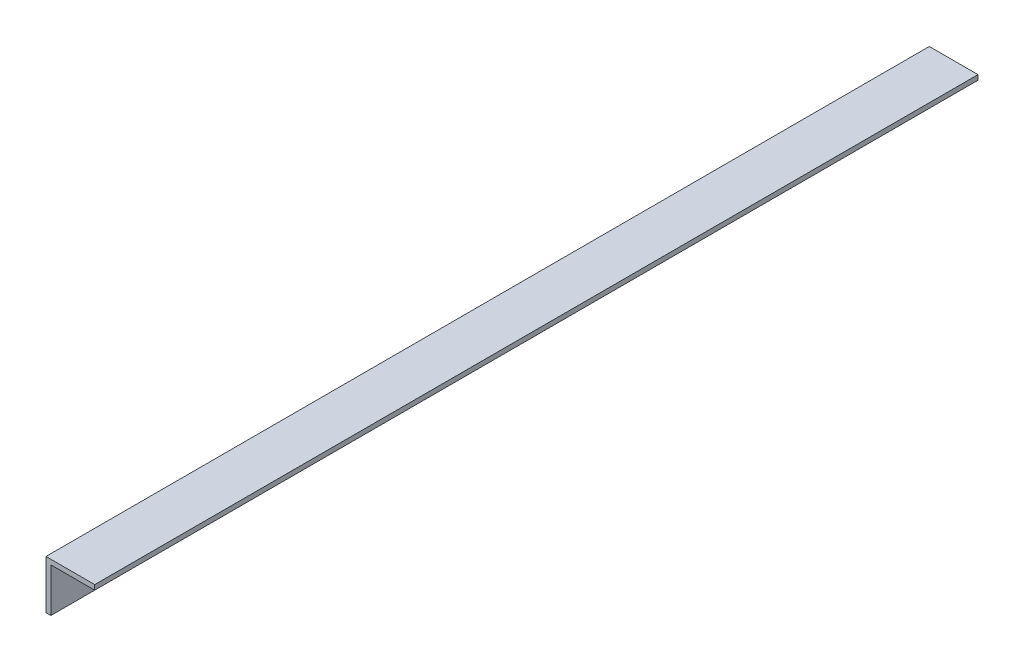
ISO-10303-21;
HEADER;
FILE_DESCRIPTION(('STEP AP214'),'2;1');
FILE_NAME('part.step','',(''),(''),'','','');
FILE_SCHEMA(('AUTOMOTIVE_DESIGN { 1 0 10303 214 1 1 1 1 }'));
ENDSEC;
DATA;
#1=APPLICATION_CONTEXT('core data for automotive mechanical design processes');
#2=APPLICATION_PROTOCOL_DEFINITION('international standard','automotive_design',2000,#1);
#3=PRODUCT_CONTEXT('',#1,'mechanical');
#4=PRODUCT('Part','Part','',(#3));
#5=PRODUCT_RELATED_PRODUCT_CATEGORY('part','',(#4));
#6=PRODUCT_DEFINITION_FORMATION('','',#4);
#7=PRODUCT_DEFINITION_CONTEXT('part definition',#1,'design');
#8=PRODUCT_DEFINITION('design','',#6,#7);
#9=PRODUCT_DEFINITION_SHAPE('','',#8);
#10=(LENGTH_UNIT() NAMED_UNIT(*) SI_UNIT(.MILLI.,.METRE.));
#11=(NAMED_UNIT(*) PLANE_ANGLE_UNIT() SI_UNIT($,.RADIAN.));
#12=(NAMED_UNIT(*) SI_UNIT($,.STERADIAN.) SOLID_ANGLE_UNIT());
#13=UNCERTAINTY_MEASURE_WITH_UNIT(LENGTH_MEASURE(1.E-05),#10,'distance_accuracy_value','');
#14=(GEOMETRIC_REPRESENTATION_CONTEXT(3) GLOBAL_UNCERTAINTY_ASSIGNED_CONTEXT((#13)) GLOBAL_UNIT_ASSIGNED_CONTEXT((#10,
#11,#12)) REPRESENTATION_CONTEXT('',''));
#15=CARTESIAN_POINT('',(0.,0.,0.));
#16=DIRECTION('',(0.,0.,1.));
#17=DIRECTION('',(1.,0.,0.));
#18=AXIS2_PLACEMENT_3D('',#15,#16,#17);
#19=CARTESIAN_POINT('',(-25.4,-2.54,460.375));
#20=DIRECTION('',(0.,1.,0.));
#21=DIRECTION('',(0.,0.,1.));
#22=AXIS2_PLACEMENT_3D('',#19,#20,#21);
#23=PLANE('',#22);
#24=DIRECTION('',(1.,0.,0.));
#25=VECTOR('',#24,1.);
#26=CARTESIAN_POINT('',(-25.4,-2.54,0.));
#27=LINE('',#26,#25);
#28=CARTESIAN_POINT('',(-22.86,-2.54,0.));
#29=VERTEX_POINT('',#28);
#30=CARTESIAN_POINT('',(0.,-2.54,0.));
#31=VERTEX_POINT('',#30);
#32=EDGE_CURVE('E113',#29,#31,#27,.T.);
#33=ORIENTED_EDGE('',*,*,#32,.T.);
#34=DIRECTION('',(0.,0.,-1.));
#35=VECTOR('',#34,1.);
#36=CARTESIAN_POINT('',(0.,-2.54,460.375));
#37=LINE('',#36,#35);
#38=CARTESIAN_POINT('',(0.,-2.54,460.375));
#39=VERTEX_POINT('',#38);
#40=EDGE_CURVE('E11',#39,#31,#37,.T.);
#41=ORIENTED_EDGE('',*,*,#40,.F.);
#42=DIRECTION('',(1.,0.,0.));
#43=VECTOR('',#42,1.);
#44=CARTESIAN_POINT('',(-25.4,-2.54,460.375));
#45=LINE('',#44,#43);
#46=CARTESIAN_POINT('',(-22.86,-2.54,460.375));
#47=VERTEX_POINT('',#46);
#48=EDGE_CURVE('E78',#47,#39,#45,.T.);
#49=ORIENTED_EDGE('',*,*,#48,.F.);
#50=DIRECTION('',(0.,0.,-1.));
#51=VECTOR('',#50,1.);
#52=CARTESIAN_POINT('',(-22.86,-2.54,460.375));
#53=LINE('',#52,#51);
#54=EDGE_CURVE('E109',#47,#29,#53,.T.);
#55=ORIENTED_EDGE('',*,*,#54,.T.);
#56=EDGE_LOOP('',(#33,#41,#49,#55));
#57=FACE_BOUND('',#56,.T.);
#58=ADVANCED_FACE('F32',(#57),#23,.F.);
#59=CARTESIAN_POINT('',(0.,0.,460.375));
#60=DIRECTION('',(1.,0.,0.));
#61=DIRECTION('',(0.,0.,-1.));
#62=AXIS2_PLACEMENT_3D('',#59,#60,#61);
#63=PLANE('',#62);
#64=DIRECTION('',(0.,-1.,0.));
#65=VECTOR('',#64,1.);
#66=CARTESIAN_POINT('',(0.,0.,0.));
#67=LINE('',#66,#65);
#68=CARTESIAN_POINT('',(0.,0.,0.));
#69=VERTEX_POINT('',#68);
#70=EDGE_CURVE('E116',#69,#31,#67,.T.);
#71=ORIENTED_EDGE('',*,*,#70,.F.);
#72=DIRECTION('',(0.,0.,-1.));
#73=VECTOR('',#72,1.);
#74=CARTESIAN_POINT('',(0.,0.,460.375));
#75=LINE('',#74,#73);
#76=CARTESIAN_POINT('',(0.,0.,460.375));
#77=VERTEX_POINT('',#76);
#78=EDGE_CURVE('E40',#77,#69,#75,.T.);
#79=ORIENTED_EDGE('',*,*,#78,.F.);
#80=DIRECTION('',(0.,-1.,0.));
#81=VECTOR('',#80,1.);
#82=CARTESIAN_POINT('',(0.,0.,460.375));
#83=LINE('',#82,#81);
#84=EDGE_CURVE('E202',#77,#39,#83,.T.);
#85=ORIENTED_EDGE('',*,*,#84,.T.);
#86=ORIENTED_EDGE('',*,*,#40,.T.);
#87=EDGE_LOOP('',(#71,#79,#85,#86));
#88=FACE_BOUND('',#87,.T.);
#89=ADVANCED_FACE('F134',(#88),#63,.T.);
#90=CARTESIAN_POINT('',(-25.4,0.,460.375));
#91=DIRECTION('',(0.,1.,0.));
#92=DIRECTION('',(0.,0.,1.));
#93=AXIS2_PLACEMENT_3D('',#90,#91,#92);
#94=PLANE('',#93);
#95=DIRECTION('',(1.,0.,0.));
#96=VECTOR('',#95,1.);
#97=CARTESIAN_POINT('',(-25.4,0.,0.));
#98=LINE('',#97,#96);
#99=CARTESIAN_POINT('',(-25.4,0.,0.));
#100=VERTEX_POINT('',#99);
#101=EDGE_CURVE('E119',#100,#69,#98,.T.);
#102=ORIENTED_EDGE('',*,*,#101,.F.);
#103=DIRECTION('',(0.,0.,-1.));
#104=VECTOR('',#103,1.);
#105=CARTESIAN_POINT('',(-25.4,0.,460.375));
#106=LINE('',#105,#104);
#107=CARTESIAN_POINT('',(-25.4,0.,460.375));
#108=VERTEX_POINT('',#107);
#109=EDGE_CURVE('E99',#108,#100,#106,.T.);
#110=ORIENTED_EDGE('',*,*,#109,.F.);
#111=DIRECTION('',(1.,0.,0.));
#112=VECTOR('',#111,1.);
#113=CARTESIAN_POINT('',(-25.4,0.,460.375));
#114=LINE('',#113,#112);
#115=EDGE_CURVE('E105',#108,#77,#114,.T.);
#116=ORIENTED_EDGE('',*,*,#115,.T.);
#117=ORIENTED_EDGE('',*,*,#78,.T.);
#118=EDGE_LOOP('',(#102,#110,#116,#117));
#119=FACE_BOUND('',#118,.T.);
#120=ADVANCED_FACE('F131',(#119),#94,.T.);
#121=CARTESIAN_POINT('',(-25.4,-25.4,460.375));
#122=DIRECTION('',(-1.,0.,0.));
#123=DIRECTION('',(0.,0.,1.));
#124=AXIS2_PLACEMENT_3D('',#121,#122,#123);
#125=PLANE('',#124);
#126=DIRECTION('',(0.,1.,0.));
#127=VECTOR('',#126,1.);
#128=CARTESIAN_POINT('',(-25.4,-25.4,0.));
#129=LINE('',#128,#127);
#130=CARTESIAN_POINT('',(-25.4,-25.4,0.));
#131=VERTEX_POINT('',#130);
#132=EDGE_CURVE('E94',#131,#100,#129,.T.);
#133=ORIENTED_EDGE('',*,*,#132,.F.);
#134=DIRECTION('',(0.,0.,-1.));
#135=VECTOR('',#134,1.);
#136=CARTESIAN_POINT('',(-25.4,-25.4,460.375));
#137=LINE('',#136,#135);
#138=CARTESIAN_POINT('',(-25.4,-25.4,460.375));
#139=VERTEX_POINT('',#138);
#140=EDGE_CURVE('E89',#139,#131,#137,.T.);
#141=ORIENTED_EDGE('',*,*,#140,.F.);
#142=DIRECTION('',(0.,1.,0.));
#143=VECTOR('',#142,1.);
#144=CARTESIAN_POINT('',(-25.4,-25.4,460.375));
#145=LINE('',#144,#143);
#146=EDGE_CURVE('E92',#139,#108,#145,.T.);
#147=ORIENTED_EDGE('',*,*,#146,.T.);
#148=ORIENTED_EDGE('',*,*,#109,.T.);
#149=EDGE_LOOP('',(#133,#141,#147,#148));
#150=FACE_BOUND('',#149,.T.);
#151=ADVANCED_FACE('F91',(#150),#125,.T.);
#152=CARTESIAN_POINT('',(-22.86,-25.4,460.375));
#153=DIRECTION('',(0.,-1.,0.));
#154=DIRECTION('',(0.,0.,-1.));
#155=AXIS2_PLACEMENT_3D('',#152,#153,#154);
#156=PLANE('',#155);
#157=DIRECTION('',(-1.,0.,0.));
#158=VECTOR('',#157,1.);
#159=CARTESIAN_POINT('',(-22.86,-25.4,0.));
#160=LINE('',#159,#158);
#161=CARTESIAN_POINT('',(-22.86,-25.4,0.));
#162=VERTEX_POINT('',#161);
#163=EDGE_CURVE('E123',#162,#131,#160,.T.);
#164=ORIENTED_EDGE('',*,*,#163,.F.);
#165=DIRECTION('',(0.,0.,-1.));
#166=VECTOR('',#165,1.);
#167=CARTESIAN_POINT('',(-22.86,-25.4,460.375));
#168=LINE('',#167,#166);
#169=CARTESIAN_POINT('',(-22.86,-25.4,460.375));
#170=VERTEX_POINT('',#169);
#171=EDGE_CURVE('E69',#170,#162,#168,.T.);
#172=ORIENTED_EDGE('',*,*,#171,.F.);
#173=DIRECTION('',(-1.,0.,0.));
#174=VECTOR('',#173,1.);
#175=CARTESIAN_POINT('',(-22.86,-25.4,460.375));
#176=LINE('',#175,#174);
#177=EDGE_CURVE('E103',#170,#139,#176,.T.);
#178=ORIENTED_EDGE('',*,*,#177,.T.);
#179=ORIENTED_EDGE('',*,*,#140,.T.);
#180=EDGE_LOOP('',(#164,#172,#178,#179));
#181=FACE_BOUND('',#180,.T.);
#182=ADVANCED_FACE('F107',(#181),#156,.T.);
#183=CARTESIAN_POINT('',(-22.86,-25.4,460.375));
#184=DIRECTION('',(-1.,0.,0.));
#185=DIRECTION('',(0.,0.,1.));
#186=AXIS2_PLACEMENT_3D('',#183,#184,#185);
#187=PLANE('',#186);
#188=DIRECTION('',(0.,1.,0.));
#189=VECTOR('',#188,1.);
#190=CARTESIAN_POINT('',(-22.86,-25.4,0.));
#191=LINE('',#190,#189);
#192=EDGE_CURVE('E72',#162,#29,#191,.T.);
#193=ORIENTED_EDGE('',*,*,#192,.T.);
#194=ORIENTED_EDGE('',*,*,#54,.F.);
#195=DIRECTION('',(0.,1.,0.));
#196=VECTOR('',#195,1.);
#197=CARTESIAN_POINT('',(-22.86,-25.4,460.375));
#198=LINE('',#197,#196);
#199=EDGE_CURVE('E48',#170,#47,#198,.T.);
#200=ORIENTED_EDGE('',*,*,#199,.F.);
#201=ORIENTED_EDGE('',*,*,#171,.T.);
#202=EDGE_LOOP('',(#193,#194,#200,#201));
#203=FACE_BOUND('',#202,.T.);
#204=ADVANCED_FACE('F139',(#203),#187,.F.);
#205=CARTESIAN_POINT('',(0.,0.,460.375));
#206=DIRECTION('',(0.,0.,-1.));
#207=DIRECTION('',(-1.,0.,0.));
#208=AXIS2_PLACEMENT_3D('',#205,#206,#207);
#209=PLANE('',#208);
#210=ORIENTED_EDGE('',*,*,#48,.T.);
#211=ORIENTED_EDGE('',*,*,#84,.F.);
#212=ORIENTED_EDGE('',*,*,#115,.F.);
#213=ORIENTED_EDGE('',*,*,#146,.F.);
#214=ORIENTED_EDGE('',*,*,#177,.F.);
#215=ORIENTED_EDGE('',*,*,#199,.T.);
#216=EDGE_LOOP('',(#210,#211,#212,#213,#214,#215));
#217=FACE_BOUND('',#216,.T.);
#218=ADVANCED_FACE('F102',(#217),#209,.F.);
#219=CARTESIAN_POINT('',(0.,0.,0.));
#220=DIRECTION('',(0.,0.,-1.));
#221=DIRECTION('',(-1.,0.,0.));
#222=AXIS2_PLACEMENT_3D('',#219,#220,#221);
#223=PLANE('',#222);
#224=ORIENTED_EDGE('',*,*,#32,.F.);
#225=ORIENTED_EDGE('',*,*,#192,.F.);
#226=ORIENTED_EDGE('',*,*,#163,.T.);
#227=ORIENTED_EDGE('',*,*,#132,.T.);
#228=ORIENTED_EDGE('',*,*,#101,.T.);
#229=ORIENTED_EDGE('',*,*,#70,.T.);
#230=EDGE_LOOP('',(#224,#225,#226,#227,#228,#229));
#231=FACE_BOUND('',#230,.T.);
#232=ADVANCED_FACE('F137',(#231),#223,.T.);
#233=CLOSED_SHELL('',(#58,#89,#120,#151,#182,#204,#218,#232));
#234=MANIFOLD_SOLID_BREP('B2',#233);
#235=ADVANCED_BREP_SHAPE_REPRESENTATION('',(#18,#234),#14);
#236=SHAPE_DEFINITION_REPRESENTATION(#9,#235);
ENDSEC;
END-ISO-10303-21;
